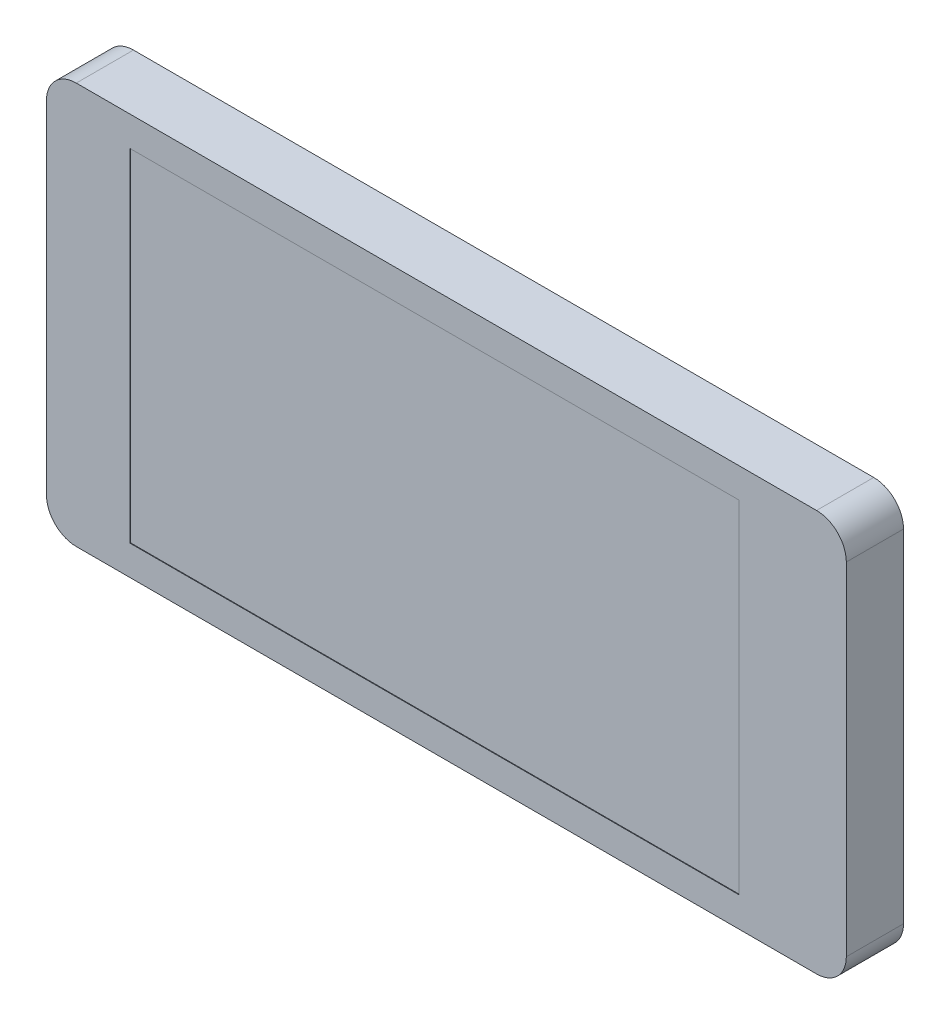
ISO-10303-21;
HEADER;
FILE_DESCRIPTION(('STEP AP214'),'2;1');
FILE_NAME('part.step','',(''),(''),'','','');
FILE_SCHEMA(('AUTOMOTIVE_DESIGN { 1 0 10303 214 1 1 1 1 }'));
ENDSEC;
DATA;
#1=APPLICATION_CONTEXT('core data for automotive mechanical design processes');
#2=APPLICATION_PROTOCOL_DEFINITION('international standard','automotive_design',2000,#1);
#3=PRODUCT_CONTEXT('',#1,'mechanical');
#4=PRODUCT('Part','Part','',(#3));
#5=PRODUCT_RELATED_PRODUCT_CATEGORY('part','',(#4));
#6=PRODUCT_DEFINITION_FORMATION('','',#4);
#7=PRODUCT_DEFINITION_CONTEXT('part definition',#1,'design');
#8=PRODUCT_DEFINITION('design','',#6,#7);
#9=PRODUCT_DEFINITION_SHAPE('','',#8);
#10=(LENGTH_UNIT() NAMED_UNIT(*) SI_UNIT(.MILLI.,.METRE.));
#11=(NAMED_UNIT(*) PLANE_ANGLE_UNIT() SI_UNIT($,.RADIAN.));
#12=(NAMED_UNIT(*) SI_UNIT($,.STERADIAN.) SOLID_ANGLE_UNIT());
#13=UNCERTAINTY_MEASURE_WITH_UNIT(LENGTH_MEASURE(1.E-05),#10,'distance_accuracy_value','');
#14=(GEOMETRIC_REPRESENTATION_CONTEXT(3) GLOBAL_UNCERTAINTY_ASSIGNED_CONTEXT((#13)) GLOBAL_UNIT_ASSIGNED_CONTEXT((#10,
#11,#12)) REPRESENTATION_CONTEXT('',''));
#15=CARTESIAN_POINT('',(0.,0.,0.));
#16=DIRECTION('',(0.,0.,1.));
#17=DIRECTION('',(1.,0.,0.));
#18=AXIS2_PLACEMENT_3D('',#15,#16,#17);
#19=CARTESIAN_POINT('',(-67.15,-33.7,4.8));
#20=DIRECTION('',(1.,0.,0.));
#21=DIRECTION('',(0.,0.,-1.));
#22=AXIS2_PLACEMENT_3D('',#19,#20,#21);
#23=PLANE('',#22);
#24=DIRECTION('',(0.,-1.,0.));
#25=VECTOR('',#24,1.);
#26=CARTESIAN_POINT('',(-67.15,-33.7,-4.8));
#27=LINE('',#26,#25);
#28=CARTESIAN_POINT('',(-67.15,28.7,-4.8));
#29=VERTEX_POINT('',#28);
#30=CARTESIAN_POINT('',(-67.15,-28.7,-4.8));
#31=VERTEX_POINT('',#30);
#32=EDGE_CURVE('E141',#29,#31,#27,.T.);
#33=ORIENTED_EDGE('',*,*,#32,.T.);
#34=DIRECTION('',(0.,0.,-1.));
#35=VECTOR('',#34,1.);
#36=CARTESIAN_POINT('',(-67.15,-28.7,4.8));
#37=LINE('',#36,#35);
#38=CARTESIAN_POINT('',(-67.15,-28.7,4.8));
#39=VERTEX_POINT('',#38);
#40=EDGE_CURVE('E182',#31,#39,#37,.F.);
#41=ORIENTED_EDGE('',*,*,#40,.T.);
#42=DIRECTION('',(0.,-1.,0.));
#43=VECTOR('',#42,1.);
#44=CARTESIAN_POINT('',(-67.15,-33.7,4.8));
#45=LINE('',#44,#43);
#46=CARTESIAN_POINT('',(-67.15,28.7,4.8));
#47=VERTEX_POINT('',#46);
#48=EDGE_CURVE('E145',#47,#39,#45,.T.);
#49=ORIENTED_EDGE('',*,*,#48,.F.);
#50=DIRECTION('',(0.,0.,-1.));
#51=VECTOR('',#50,1.);
#52=CARTESIAN_POINT('',(-67.15,28.7,4.8));
#53=LINE('',#52,#51);
#54=EDGE_CURVE('E179',#47,#29,#53,.T.);
#55=ORIENTED_EDGE('',*,*,#54,.T.);
#56=EDGE_LOOP('',(#33,#41,#49,#55));
#57=FACE_BOUND('',#56,.T.);
#58=ADVANCED_FACE('F17',(#57),#23,.F.);
#59=CARTESIAN_POINT('',(67.15,-33.7,4.8));
#60=DIRECTION('',(0.,1.,0.));
#61=DIRECTION('',(-1.,0.,0.));
#62=AXIS2_PLACEMENT_3D('',#59,#60,#61);
#63=PLANE('',#62);
#64=DIRECTION('',(1.,0.,0.));
#65=VECTOR('',#64,1.);
#66=CARTESIAN_POINT('',(67.15,-33.7,4.8));
#67=LINE('',#66,#65);
#68=CARTESIAN_POINT('',(-62.15,-33.7,4.8));
#69=VERTEX_POINT('',#68);
#70=CARTESIAN_POINT('',(62.15,-33.7,4.8));
#71=VERTEX_POINT('',#70);
#72=EDGE_CURVE('E148',#69,#71,#67,.T.);
#73=ORIENTED_EDGE('',*,*,#72,.F.);
#74=DIRECTION('',(0.,0.,-1.));
#75=VECTOR('',#74,1.);
#76=CARTESIAN_POINT('',(-62.15,-33.7,4.8));
#77=LINE('',#76,#75);
#78=CARTESIAN_POINT('',(-62.15,-33.7,-4.8));
#79=VERTEX_POINT('',#78);
#80=EDGE_CURVE('E168',#69,#79,#77,.T.);
#81=ORIENTED_EDGE('',*,*,#80,.T.);
#82=DIRECTION('',(1.,0.,0.));
#83=VECTOR('',#82,1.);
#84=CARTESIAN_POINT('',(67.15,-33.7,-4.8));
#85=LINE('',#84,#83);
#86=CARTESIAN_POINT('',(62.15,-33.7,-4.8));
#87=VERTEX_POINT('',#86);
#88=EDGE_CURVE('E160',#79,#87,#85,.T.);
#89=ORIENTED_EDGE('',*,*,#88,.T.);
#90=DIRECTION('',(0.,0.,-1.));
#91=VECTOR('',#90,1.);
#92=CARTESIAN_POINT('',(62.15,-33.7,4.8));
#93=LINE('',#92,#91);
#94=EDGE_CURVE('E157',#87,#71,#93,.F.);
#95=ORIENTED_EDGE('',*,*,#94,.T.);
#96=EDGE_LOOP('',(#73,#81,#89,#95));
#97=FACE_BOUND('',#96,.T.);
#98=ADVANCED_FACE('F222',(#97),#63,.F.);
#99=CARTESIAN_POINT('',(67.15,-33.7,4.8));
#100=DIRECTION('',(-1.,0.,0.));
#101=DIRECTION('',(0.,0.,1.));
#102=AXIS2_PLACEMENT_3D('',#99,#100,#101);
#103=PLANE('',#102);
#104=DIRECTION('',(0.,1.,0.));
#105=VECTOR('',#104,1.);
#106=CARTESIAN_POINT('',(67.15,-33.7,4.8));
#107=LINE('',#106,#105);
#108=CARTESIAN_POINT('',(67.15,-28.7,4.8));
#109=VERTEX_POINT('',#108);
#110=CARTESIAN_POINT('',(67.15,28.7,4.8));
#111=VERTEX_POINT('',#110);
#112=EDGE_CURVE('E152',#109,#111,#107,.T.);
#113=ORIENTED_EDGE('',*,*,#112,.F.);
#114=DIRECTION('',(0.,0.,-1.));
#115=VECTOR('',#114,1.);
#116=CARTESIAN_POINT('',(67.15,-28.7,4.8));
#117=LINE('',#116,#115);
#118=CARTESIAN_POINT('',(67.15,-28.7,-4.8));
#119=VERTEX_POINT('',#118);
#120=EDGE_CURVE('E194',#109,#119,#117,.T.);
#121=ORIENTED_EDGE('',*,*,#120,.T.);
#122=DIRECTION('',(0.,1.,0.));
#123=VECTOR('',#122,1.);
#124=CARTESIAN_POINT('',(67.15,-33.7,-4.8));
#125=LINE('',#124,#123);
#126=CARTESIAN_POINT('',(67.15,28.7,-4.8));
#127=VERTEX_POINT('',#126);
#128=EDGE_CURVE('E163',#119,#127,#125,.T.);
#129=ORIENTED_EDGE('',*,*,#128,.T.);
#130=DIRECTION('',(0.,0.,-1.));
#131=VECTOR('',#130,1.);
#132=CARTESIAN_POINT('',(67.15,28.7,4.8));
#133=LINE('',#132,#131);
#134=EDGE_CURVE('E192',#127,#111,#133,.F.);
#135=ORIENTED_EDGE('',*,*,#134,.T.);
#136=EDGE_LOOP('',(#113,#121,#129,#135));
#137=FACE_BOUND('',#136,.T.);
#138=ADVANCED_FACE('F230',(#137),#103,.F.);
#139=CARTESIAN_POINT('',(67.15,33.7,4.8));
#140=DIRECTION('',(0.,-1.,0.));
#141=DIRECTION('',(1.,0.,0.));
#142=AXIS2_PLACEMENT_3D('',#139,#140,#141);
#143=PLANE('',#142);
#144=DIRECTION('',(-1.,0.,0.));
#145=VECTOR('',#144,1.);
#146=CARTESIAN_POINT('',(67.15,33.7,-4.8));
#147=LINE('',#146,#145);
#148=CARTESIAN_POINT('',(62.15,33.7,-4.8));
#149=VERTEX_POINT('',#148);
#150=CARTESIAN_POINT('',(-62.15,33.7,-4.8));
#151=VERTEX_POINT('',#150);
#152=EDGE_CURVE('E149',#149,#151,#147,.T.);
#153=ORIENTED_EDGE('',*,*,#152,.T.);
#154=DIRECTION('',(0.,0.,-1.));
#155=VECTOR('',#154,1.);
#156=CARTESIAN_POINT('',(-62.15,33.7,4.8));
#157=LINE('',#156,#155);
#158=CARTESIAN_POINT('',(-62.15,33.7,4.8));
#159=VERTEX_POINT('',#158);
#160=EDGE_CURVE('E11',#151,#159,#157,.F.);
#161=ORIENTED_EDGE('',*,*,#160,.T.);
#162=DIRECTION('',(-1.,0.,0.));
#163=VECTOR('',#162,1.);
#164=CARTESIAN_POINT('',(67.15,33.7,4.8));
#165=LINE('',#164,#163);
#166=CARTESIAN_POINT('',(62.15,33.7,4.8));
#167=VERTEX_POINT('',#166);
#168=EDGE_CURVE('E155',#167,#159,#165,.T.);
#169=ORIENTED_EDGE('',*,*,#168,.F.);
#170=DIRECTION('',(0.,0.,-1.));
#171=VECTOR('',#170,1.);
#172=CARTESIAN_POINT('',(62.15,33.7,4.8));
#173=LINE('',#172,#171);
#174=EDGE_CURVE('E25',#167,#149,#173,.T.);
#175=ORIENTED_EDGE('',*,*,#174,.T.);
#176=EDGE_LOOP('',(#153,#161,#169,#175));
#177=FACE_BOUND('',#176,.T.);
#178=ADVANCED_FACE('F199',(#177),#143,.F.);
#179=CARTESIAN_POINT('',(0.,0.,4.8));
#180=DIRECTION('',(0.,0.,1.));
#181=DIRECTION('',(1.,0.,0.));
#182=AXIS2_PLACEMENT_3D('',#179,#180,#181);
#183=PLANE('',#182);
#184=DIRECTION('',(0.,-1.,0.));
#185=VECTOR('',#184,1.);
#186=CARTESIAN_POINT('',(-53.15,28.7,4.8));
#187=LINE('',#186,#185);
#188=CARTESIAN_POINT('',(-53.15,28.7,4.8));
#189=VERTEX_POINT('',#188);
#190=CARTESIAN_POINT('',(-53.15,-28.7,4.8));
#191=VERTEX_POINT('',#190);
#192=EDGE_CURVE('E32',#189,#191,#187,.T.);
#193=ORIENTED_EDGE('',*,*,#192,.F.);
#194=DIRECTION('',(-1.,0.,0.));
#195=VECTOR('',#194,1.);
#196=CARTESIAN_POINT('',(-53.15,28.7,4.8));
#197=LINE('',#196,#195);
#198=CARTESIAN_POINT('',(49.15,28.7,4.8));
#199=VERTEX_POINT('',#198);
#200=EDGE_CURVE('E126',#199,#189,#197,.T.);
#201=ORIENTED_EDGE('',*,*,#200,.F.);
#202=DIRECTION('',(0.,1.,0.));
#203=VECTOR('',#202,1.);
#204=CARTESIAN_POINT('',(49.15,28.7,4.8));
#205=LINE('',#204,#203);
#206=CARTESIAN_POINT('',(49.15,-28.7,4.8));
#207=VERTEX_POINT('',#206);
#208=EDGE_CURVE('E129',#207,#199,#205,.T.);
#209=ORIENTED_EDGE('',*,*,#208,.F.);
#210=DIRECTION('',(1.,0.,0.));
#211=VECTOR('',#210,1.);
#212=CARTESIAN_POINT('',(-53.15,-28.7,4.8));
#213=LINE('',#212,#211);
#214=EDGE_CURVE('E135',#191,#207,#213,.T.);
#215=ORIENTED_EDGE('',*,*,#214,.F.);
#216=EDGE_LOOP('',(#193,#201,#209,#215));
#217=FACE_BOUND('',#216,.T.);
#218=ORIENTED_EDGE('',*,*,#48,.T.);
#219=CARTESIAN_POINT('',(-62.15,-28.7,4.8));
#220=DIRECTION('',(0.,0.,1.));
#221=DIRECTION('',(1.,0.,0.));
#222=AXIS2_PLACEMENT_3D('',#219,#220,#221);
#223=CIRCLE('',#222,5.);
#224=EDGE_CURVE('E190',#39,#69,#223,.T.);
#225=ORIENTED_EDGE('',*,*,#224,.T.);
#226=ORIENTED_EDGE('',*,*,#72,.T.);
#227=CARTESIAN_POINT('',(62.15,-28.7,4.8));
#228=DIRECTION('',(0.,0.,1.));
#229=DIRECTION('',(1.,0.,0.));
#230=AXIS2_PLACEMENT_3D('',#227,#228,#229);
#231=CIRCLE('',#230,5.);
#232=EDGE_CURVE('E188',#71,#109,#231,.T.);
#233=ORIENTED_EDGE('',*,*,#232,.T.);
#234=ORIENTED_EDGE('',*,*,#112,.T.);
#235=CARTESIAN_POINT('',(62.15,28.7,4.8));
#236=DIRECTION('',(0.,0.,1.));
#237=DIRECTION('',(1.,0.,0.));
#238=AXIS2_PLACEMENT_3D('',#235,#236,#237);
#239=CIRCLE('',#238,5.);
#240=EDGE_CURVE('E184',#111,#167,#239,.T.);
#241=ORIENTED_EDGE('',*,*,#240,.T.);
#242=ORIENTED_EDGE('',*,*,#168,.T.);
#243=CARTESIAN_POINT('',(-62.15,28.7,4.8));
#244=DIRECTION('',(0.,0.,1.));
#245=DIRECTION('',(1.,0.,0.));
#246=AXIS2_PLACEMENT_3D('',#243,#244,#245);
#247=CIRCLE('',#246,5.);
#248=EDGE_CURVE('E186',#159,#47,#247,.T.);
#249=ORIENTED_EDGE('',*,*,#248,.T.);
#250=EDGE_LOOP('',(#218,#225,#226,#233,#234,#241,#242,#249));
#251=FACE_BOUND('',#250,.T.);
#252=ADVANCED_FACE('F216',(#217,#251),#183,.T.);
#253=CARTESIAN_POINT('',(0.,0.,-4.8));
#254=DIRECTION('',(0.,0.,1.));
#255=DIRECTION('',(1.,0.,0.));
#256=AXIS2_PLACEMENT_3D('',#253,#254,#255);
#257=PLANE('',#256);
#258=ORIENTED_EDGE('',*,*,#88,.F.);
#259=CARTESIAN_POINT('',(-62.15,-28.7,-4.8));
#260=DIRECTION('',(0.,0.,1.));
#261=DIRECTION('',(1.,0.,0.));
#262=AXIS2_PLACEMENT_3D('',#259,#260,#261);
#263=CIRCLE('',#262,5.);
#264=EDGE_CURVE('E177',#79,#31,#263,.F.);
#265=ORIENTED_EDGE('',*,*,#264,.T.);
#266=ORIENTED_EDGE('',*,*,#32,.F.);
#267=CARTESIAN_POINT('',(-62.15,28.7,-4.8));
#268=DIRECTION('',(0.,0.,1.));
#269=DIRECTION('',(1.,0.,0.));
#270=AXIS2_PLACEMENT_3D('',#267,#268,#269);
#271=CIRCLE('',#270,5.);
#272=EDGE_CURVE('E173',#29,#151,#271,.F.);
#273=ORIENTED_EDGE('',*,*,#272,.T.);
#274=ORIENTED_EDGE('',*,*,#152,.F.);
#275=CARTESIAN_POINT('',(62.15,28.7,-4.8));
#276=DIRECTION('',(0.,0.,1.));
#277=DIRECTION('',(1.,0.,0.));
#278=AXIS2_PLACEMENT_3D('',#275,#276,#277);
#279=CIRCLE('',#278,5.);
#280=EDGE_CURVE('E171',#149,#127,#279,.F.);
#281=ORIENTED_EDGE('',*,*,#280,.T.);
#282=ORIENTED_EDGE('',*,*,#128,.F.);
#283=CARTESIAN_POINT('',(62.15,-28.7,-4.8));
#284=DIRECTION('',(0.,0.,1.));
#285=DIRECTION('',(1.,0.,0.));
#286=AXIS2_PLACEMENT_3D('',#283,#284,#285);
#287=CIRCLE('',#286,5.);
#288=EDGE_CURVE('E175',#119,#87,#287,.F.);
#289=ORIENTED_EDGE('',*,*,#288,.T.);
#290=EDGE_LOOP('',(#258,#265,#266,#273,#274,#281,#282,#289));
#291=FACE_BOUND('',#290,.T.);
#292=ADVANCED_FACE('F204',(#291),#257,.F.);
#293=CARTESIAN_POINT('',(-62.15,-28.7,4.8));
#294=DIRECTION('',(0.,0.,-1.));
#295=DIRECTION('',(-1.,0.,0.));
#296=AXIS2_PLACEMENT_3D('',#293,#294,#295);
#297=CYLINDRICAL_SURFACE('',#296,5.);
#298=ORIENTED_EDGE('',*,*,#224,.F.);
#299=ORIENTED_EDGE('',*,*,#40,.F.);
#300=ORIENTED_EDGE('',*,*,#264,.F.);
#301=ORIENTED_EDGE('',*,*,#80,.F.);
#302=EDGE_LOOP('',(#298,#299,#300,#301));
#303=FACE_BOUND('',#302,.T.);
#304=ADVANCED_FACE('F220',(#303),#297,.T.);
#305=CARTESIAN_POINT('',(62.15,-28.7,4.8));
#306=DIRECTION('',(0.,0.,-1.));
#307=DIRECTION('',(-1.,0.,0.));
#308=AXIS2_PLACEMENT_3D('',#305,#306,#307);
#309=CYLINDRICAL_SURFACE('',#308,5.);
#310=ORIENTED_EDGE('',*,*,#232,.F.);
#311=ORIENTED_EDGE('',*,*,#94,.F.);
#312=ORIENTED_EDGE('',*,*,#288,.F.);
#313=ORIENTED_EDGE('',*,*,#120,.F.);
#314=EDGE_LOOP('',(#310,#311,#312,#313));
#315=FACE_BOUND('',#314,.T.);
#316=ADVANCED_FACE('F227',(#315),#309,.T.);
#317=CARTESIAN_POINT('',(-62.15,28.7,4.8));
#318=DIRECTION('',(0.,0.,-1.));
#319=DIRECTION('',(-1.,0.,0.));
#320=AXIS2_PLACEMENT_3D('',#317,#318,#319);
#321=CYLINDRICAL_SURFACE('',#320,5.);
#322=ORIENTED_EDGE('',*,*,#248,.F.);
#323=ORIENTED_EDGE('',*,*,#160,.F.);
#324=ORIENTED_EDGE('',*,*,#272,.F.);
#325=ORIENTED_EDGE('',*,*,#54,.F.);
#326=EDGE_LOOP('',(#322,#323,#324,#325));
#327=FACE_BOUND('',#326,.T.);
#328=ADVANCED_FACE('F210',(#327),#321,.T.);
#329=CARTESIAN_POINT('',(62.15,28.7,4.8));
#330=DIRECTION('',(0.,0.,-1.));
#331=DIRECTION('',(-1.,0.,0.));
#332=AXIS2_PLACEMENT_3D('',#329,#330,#331);
#333=CYLINDRICAL_SURFACE('',#332,5.);
#334=ORIENTED_EDGE('',*,*,#240,.F.);
#335=ORIENTED_EDGE('',*,*,#134,.F.);
#336=ORIENTED_EDGE('',*,*,#280,.F.);
#337=ORIENTED_EDGE('',*,*,#174,.F.);
#338=EDGE_LOOP('',(#334,#335,#336,#337));
#339=FACE_BOUND('',#338,.T.);
#340=ADVANCED_FACE('F19',(#339),#333,.T.);
#341=CARTESIAN_POINT('',(-53.15,28.7,4.7));
#342=DIRECTION('',(-1.,0.,0.));
#343=DIRECTION('',(0.,-1.,0.));
#344=AXIS2_PLACEMENT_3D('',#341,#342,#343);
#345=PLANE('',#344);
#346=ORIENTED_EDGE('',*,*,#192,.T.);
#347=DIRECTION('',(0.,0.,1.));
#348=VECTOR('',#347,1.);
#349=CARTESIAN_POINT('',(-53.15,-28.7,4.7));
#350=LINE('',#349,#348);
#351=CARTESIAN_POINT('',(-53.15,-28.7,4.7));
#352=VERTEX_POINT('',#351);
#353=EDGE_CURVE('E104',#352,#191,#350,.T.);
#354=ORIENTED_EDGE('',*,*,#353,.F.);
#355=DIRECTION('',(0.,-1.,0.));
#356=VECTOR('',#355,1.);
#357=CARTESIAN_POINT('',(-53.15,28.7,4.7));
#358=LINE('',#357,#356);
#359=CARTESIAN_POINT('',(-53.15,28.7,4.7));
#360=VERTEX_POINT('',#359);
#361=EDGE_CURVE('E108',#360,#352,#358,.T.);
#362=ORIENTED_EDGE('',*,*,#361,.F.);
#363=DIRECTION('',(0.,0.,1.));
#364=VECTOR('',#363,1.);
#365=CARTESIAN_POINT('',(-53.15,28.7,4.7));
#366=LINE('',#365,#364);
#367=EDGE_CURVE('E139',#360,#189,#366,.T.);
#368=ORIENTED_EDGE('',*,*,#367,.T.);
#369=EDGE_LOOP('',(#346,#354,#362,#368));
#370=FACE_BOUND('',#369,.T.);
#371=ADVANCED_FACE('F106',(#370),#345,.F.);
#372=CARTESIAN_POINT('',(-53.15,28.7,4.7));
#373=DIRECTION('',(0.,1.,0.));
#374=DIRECTION('',(0.,0.,1.));
#375=AXIS2_PLACEMENT_3D('',#372,#373,#374);
#376=PLANE('',#375);
#377=ORIENTED_EDGE('',*,*,#200,.T.);
#378=ORIENTED_EDGE('',*,*,#367,.F.);
#379=DIRECTION('',(-1.,0.,0.));
#380=VECTOR('',#379,1.);
#381=CARTESIAN_POINT('',(-53.15,28.7,4.7));
#382=LINE('',#381,#380);
#383=CARTESIAN_POINT('',(49.15,28.7,4.7));
#384=VERTEX_POINT('',#383);
#385=EDGE_CURVE('E114',#384,#360,#382,.T.);
#386=ORIENTED_EDGE('',*,*,#385,.F.);
#387=DIRECTION('',(0.,0.,1.));
#388=VECTOR('',#387,1.);
#389=CARTESIAN_POINT('',(49.15,28.7,4.7));
#390=LINE('',#389,#388);
#391=EDGE_CURVE('E142',#384,#199,#390,.T.);
#392=ORIENTED_EDGE('',*,*,#391,.T.);
#393=EDGE_LOOP('',(#377,#378,#386,#392));
#394=FACE_BOUND('',#393,.T.);
#395=ADVANCED_FACE('F239',(#394),#376,.F.);
#396=CARTESIAN_POINT('',(49.15,28.7,4.7));
#397=DIRECTION('',(1.,0.,0.));
#398=DIRECTION('',(0.,1.,0.));
#399=AXIS2_PLACEMENT_3D('',#396,#397,#398);
#400=PLANE('',#399);
#401=ORIENTED_EDGE('',*,*,#208,.T.);
#402=ORIENTED_EDGE('',*,*,#391,.F.);
#403=DIRECTION('',(0.,1.,0.));
#404=VECTOR('',#403,1.);
#405=CARTESIAN_POINT('',(49.15,28.7,4.7));
#406=LINE('',#405,#404);
#407=CARTESIAN_POINT('',(49.15,-28.7,4.7));
#408=VERTEX_POINT('',#407);
#409=EDGE_CURVE('E122',#408,#384,#406,.T.);
#410=ORIENTED_EDGE('',*,*,#409,.F.);
#411=DIRECTION('',(0.,0.,1.));
#412=VECTOR('',#411,1.);
#413=CARTESIAN_POINT('',(49.15,-28.7,4.7));
#414=LINE('',#413,#412);
#415=EDGE_CURVE('E113',#408,#207,#414,.T.);
#416=ORIENTED_EDGE('',*,*,#415,.T.);
#417=EDGE_LOOP('',(#401,#402,#410,#416));
#418=FACE_BOUND('',#417,.T.);
#419=ADVANCED_FACE('F288',(#418),#400,.F.);
#420=CARTESIAN_POINT('',(-53.15,-28.7,4.7));
#421=DIRECTION('',(0.,-1.,0.));
#422=DIRECTION('',(0.,0.,-1.));
#423=AXIS2_PLACEMENT_3D('',#420,#421,#422);
#424=PLANE('',#423);
#425=ORIENTED_EDGE('',*,*,#214,.T.);
#426=ORIENTED_EDGE('',*,*,#415,.F.);
#427=DIRECTION('',(1.,0.,0.));
#428=VECTOR('',#427,1.);
#429=CARTESIAN_POINT('',(-53.15,-28.7,4.7));
#430=LINE('',#429,#428);
#431=EDGE_CURVE('E117',#352,#408,#430,.T.);
#432=ORIENTED_EDGE('',*,*,#431,.F.);
#433=ORIENTED_EDGE('',*,*,#353,.T.);
#434=EDGE_LOOP('',(#425,#426,#432,#433));
#435=FACE_BOUND('',#434,.T.);
#436=ADVANCED_FACE('F118',(#435),#424,.F.);
#437=CARTESIAN_POINT('',(0.,0.,4.7));
#438=DIRECTION('',(0.,0.,1.));
#439=DIRECTION('',(1.,0.,0.));
#440=AXIS2_PLACEMENT_3D('',#437,#438,#439);
#441=PLANE('',#440);
#442=ORIENTED_EDGE('',*,*,#361,.T.);
#443=ORIENTED_EDGE('',*,*,#431,.T.);
#444=ORIENTED_EDGE('',*,*,#409,.T.);
#445=ORIENTED_EDGE('',*,*,#385,.T.);
#446=EDGE_LOOP('',(#442,#443,#444,#445));
#447=FACE_BOUND('',#446,.T.);
#448=ADVANCED_FACE('F124',(#447),#441,.T.);
#449=CLOSED_SHELL('',(#58,#98,#138,#178,#252,#292,#304,#316,#328,#340,#371,#395,#419,#436,#448));
#450=MANIFOLD_SOLID_BREP('B1',#449);
#451=ADVANCED_BREP_SHAPE_REPRESENTATION('',(#18,#450),#14);
#452=SHAPE_DEFINITION_REPRESENTATION(#9,#451);
ENDSEC;
END-ISO-10303-21;
